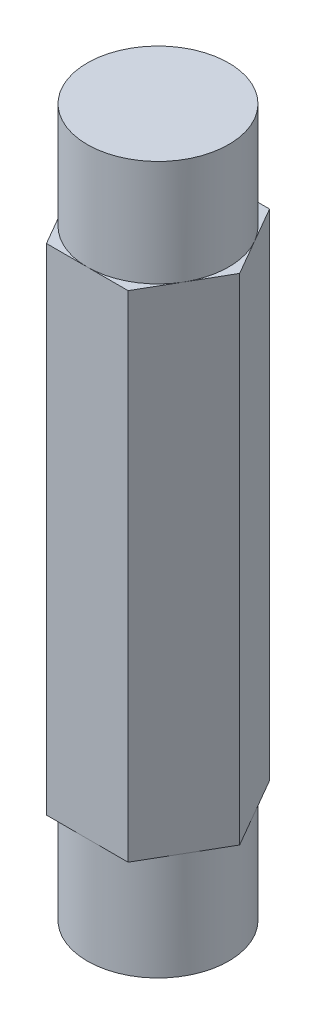
ISO-10303-21;
HEADER;
FILE_DESCRIPTION(('STEP AP214'),'2;1');
FILE_NAME('part.step','',(''),(''),'','','');
FILE_SCHEMA(('AUTOMOTIVE_DESIGN { 1 0 10303 214 1 1 1 1 }'));
ENDSEC;
DATA;
#1=APPLICATION_CONTEXT('core data for automotive mechanical design processes');
#2=APPLICATION_PROTOCOL_DEFINITION('international standard','automotive_design',2000,#1);
#3=PRODUCT_CONTEXT('',#1,'mechanical');
#4=PRODUCT('Part','Part','',(#3));
#5=PRODUCT_RELATED_PRODUCT_CATEGORY('part','',(#4));
#6=PRODUCT_DEFINITION_FORMATION('','',#4);
#7=PRODUCT_DEFINITION_CONTEXT('part definition',#1,'design');
#8=PRODUCT_DEFINITION('design','',#6,#7);
#9=PRODUCT_DEFINITION_SHAPE('','',#8);
#10=(LENGTH_UNIT() NAMED_UNIT(*) SI_UNIT(.MILLI.,.METRE.));
#11=(NAMED_UNIT(*) PLANE_ANGLE_UNIT() SI_UNIT($,.RADIAN.));
#12=(NAMED_UNIT(*) SI_UNIT($,.STERADIAN.) SOLID_ANGLE_UNIT());
#13=UNCERTAINTY_MEASURE_WITH_UNIT(LENGTH_MEASURE(1.E-05),#10,'distance_accuracy_value','');
#14=(GEOMETRIC_REPRESENTATION_CONTEXT(3) GLOBAL_UNCERTAINTY_ASSIGNED_CONTEXT((#13)) GLOBAL_UNIT_ASSIGNED_CONTEXT((#10,
#11,#12)) REPRESENTATION_CONTEXT('',''));
#15=CARTESIAN_POINT('',(0.,0.,0.));
#16=DIRECTION('',(0.,0.,1.));
#17=DIRECTION('',(1.,0.,0.));
#18=AXIS2_PLACEMENT_3D('',#15,#16,#17);
#19=CARTESIAN_POINT('',(0.,-7.,0.));
#20=DIRECTION('',(0.,1.,0.));
#21=DIRECTION('',(0.,0.,1.));
#22=AXIS2_PLACEMENT_3D('',#19,#20,#21);
#23=PLANE('',#22);
#24=DIRECTION('',(1.,0.,0.));
#25=VECTOR('',#24,1.);
#26=CARTESIAN_POINT('',(-1.15470053837925,-7.,2.));
#27=LINE('',#26,#25);
#28=CARTESIAN_POINT('',(0.,-7.,2.));
#29=VERTEX_POINT('',#28);
#30=CARTESIAN_POINT('',(1.15470053837925,-7.,2.));
#31=VERTEX_POINT('',#30);
#32=EDGE_CURVE('E138',#29,#31,#27,.T.);
#33=ORIENTED_EDGE('',*,*,#32,.F.);
#34=CARTESIAN_POINT('',(0.,-7.,0.));
#35=DIRECTION('',(0.,1.,0.));
#36=DIRECTION('',(0.,0.,1.));
#37=AXIS2_PLACEMENT_3D('',#34,#35,#36);
#38=CIRCLE('',#37,2.);
#39=CARTESIAN_POINT('',(1.73205080756887,-7.,0.999999999999999));
#40=VERTEX_POINT('',#39);
#41=EDGE_CURVE('E49',#29,#40,#38,.T.);
#42=ORIENTED_EDGE('',*,*,#41,.T.);
#43=DIRECTION('',(0.5,0.,-0.866025403784439));
#44=VECTOR('',#43,1.);
#45=CARTESIAN_POINT('',(1.15470053837925,-7.,2.));
#46=LINE('',#45,#44);
#47=EDGE_CURVE('E140',#31,#40,#46,.T.);
#48=ORIENTED_EDGE('',*,*,#47,.F.);
#49=EDGE_LOOP('',(#33,#42,#48));
#50=FACE_BOUND('',#49,.T.);
#51=ADVANCED_FACE('F39',(#50),#23,.F.);
#52=CARTESIAN_POINT('',(2.3094010767585,-7.,0.));
#53=VERTEX_POINT('',#52);
#54=EDGE_CURVE('E141',#40,#53,#46,.T.);
#55=ORIENTED_EDGE('',*,*,#54,.F.);
#56=CARTESIAN_POINT('',(1.73205080756888,-7.,-0.999999999999998));
#57=VERTEX_POINT('',#56);
#58=EDGE_CURVE('E11',#40,#57,#38,.T.);
#59=ORIENTED_EDGE('',*,*,#58,.T.);
#60=DIRECTION('',(-0.5,0.,-0.866025403784439));
#61=VECTOR('',#60,1.);
#62=CARTESIAN_POINT('',(2.3094010767585,-7.,0.));
#63=LINE('',#62,#61);
#64=EDGE_CURVE('E148',#53,#57,#63,.T.);
#65=ORIENTED_EDGE('',*,*,#64,.F.);
#66=EDGE_LOOP('',(#55,#59,#65));
#67=FACE_BOUND('',#66,.T.);
#68=ADVANCED_FACE('F145',(#67),#23,.F.);
#69=CARTESIAN_POINT('',(1.15470053837925,-7.,-2.));
#70=VERTEX_POINT('',#69);
#71=EDGE_CURVE('E160',#57,#70,#63,.T.);
#72=ORIENTED_EDGE('',*,*,#71,.F.);
#73=CARTESIAN_POINT('',(0.,-7.,-2.));
#74=VERTEX_POINT('',#73);
#75=EDGE_CURVE('E48',#57,#74,#38,.T.);
#76=ORIENTED_EDGE('',*,*,#75,.T.);
#77=DIRECTION('',(-1.,0.,0.));
#78=VECTOR('',#77,1.);
#79=CARTESIAN_POINT('',(1.15470053837925,-7.,-2.));
#80=LINE('',#79,#78);
#81=EDGE_CURVE('E233',#70,#74,#80,.T.);
#82=ORIENTED_EDGE('',*,*,#81,.F.);
#83=EDGE_LOOP('',(#72,#76,#82));
#84=FACE_BOUND('',#83,.T.);
#85=ADVANCED_FACE('F265',(#84),#23,.F.);
#86=CARTESIAN_POINT('',(-1.15470053837925,-7.,-2.));
#87=VERTEX_POINT('',#86);
#88=EDGE_CURVE('E199',#74,#87,#80,.T.);
#89=ORIENTED_EDGE('',*,*,#88,.F.);
#90=CARTESIAN_POINT('',(-1.73205080756887,-7.,-0.999999999999999));
#91=VERTEX_POINT('',#90);
#92=EDGE_CURVE('E258',#74,#91,#38,.T.);
#93=ORIENTED_EDGE('',*,*,#92,.T.);
#94=DIRECTION('',(-0.5,0.,0.866025403784439));
#95=VECTOR('',#94,1.);
#96=CARTESIAN_POINT('',(-1.15470053837925,-7.,-2.));
#97=LINE('',#96,#95);
#98=EDGE_CURVE('E240',#87,#91,#97,.T.);
#99=ORIENTED_EDGE('',*,*,#98,.F.);
#100=EDGE_LOOP('',(#89,#93,#99));
#101=FACE_BOUND('',#100,.T.);
#102=ADVANCED_FACE('F263',(#101),#23,.F.);
#103=CARTESIAN_POINT('',(-2.3094010767585,-7.,0.));
#104=VERTEX_POINT('',#103);
#105=EDGE_CURVE('E237',#91,#104,#97,.T.);
#106=ORIENTED_EDGE('',*,*,#105,.F.);
#107=CARTESIAN_POINT('',(-1.73205080756888,-7.,0.999999999999998));
#108=VERTEX_POINT('',#107);
#109=EDGE_CURVE('E201',#91,#108,#38,.T.);
#110=ORIENTED_EDGE('',*,*,#109,.T.);
#111=DIRECTION('',(0.5,0.,0.866025403784439));
#112=VECTOR('',#111,1.);
#113=CARTESIAN_POINT('',(-2.3094010767585,-7.,0.));
#114=LINE('',#113,#112);
#115=EDGE_CURVE('E239',#104,#108,#114,.T.);
#116=ORIENTED_EDGE('',*,*,#115,.F.);
#117=EDGE_LOOP('',(#106,#110,#116));
#118=FACE_BOUND('',#117,.T.);
#119=ADVANCED_FACE('F254',(#118),#23,.F.);
#120=CARTESIAN_POINT('',(0.,7.,0.));
#121=DIRECTION('',(0.,1.,0.));
#122=DIRECTION('',(0.,0.,1.));
#123=AXIS2_PLACEMENT_3D('',#120,#121,#122);
#124=PLANE('',#123);
#125=CARTESIAN_POINT('',(0.,7.,0.));
#126=DIRECTION('',(0.,1.,0.));
#127=DIRECTION('',(0.,0.,1.));
#128=AXIS2_PLACEMENT_3D('',#125,#126,#127);
#129=CIRCLE('',#128,2.);
#130=CARTESIAN_POINT('',(0.,7.,2.));
#131=VERTEX_POINT('',#130);
#132=CARTESIAN_POINT('',(1.73205080756887,7.,0.999999999999999));
#133=VERTEX_POINT('',#132);
#134=EDGE_CURVE('E189',#131,#133,#129,.T.);
#135=ORIENTED_EDGE('',*,*,#134,.F.);
#136=DIRECTION('',(1.,0.,0.));
#137=VECTOR('',#136,1.);
#138=CARTESIAN_POINT('',(-1.15470053837925,7.,2.));
#139=LINE('',#138,#137);
#140=CARTESIAN_POINT('',(1.15470053837925,7.,2.));
#141=VERTEX_POINT('',#140);
#142=EDGE_CURVE('E223',#131,#141,#139,.T.);
#143=ORIENTED_EDGE('',*,*,#142,.T.);
#144=DIRECTION('',(0.5,0.,-0.866025403784439));
#145=VECTOR('',#144,1.);
#146=CARTESIAN_POINT('',(1.15470053837925,7.,2.));
#147=LINE('',#146,#145);
#148=EDGE_CURVE('E226',#141,#133,#147,.T.);
#149=ORIENTED_EDGE('',*,*,#148,.T.);
#150=EDGE_LOOP('',(#135,#143,#149));
#151=FACE_BOUND('',#150,.T.);
#152=ADVANCED_FACE('F269',(#151),#124,.T.);
#153=CARTESIAN_POINT('',(1.73205080756888,7.,-0.999999999999999));
#154=VERTEX_POINT('',#153);
#155=EDGE_CURVE('E198',#133,#154,#129,.T.);
#156=ORIENTED_EDGE('',*,*,#155,.F.);
#157=CARTESIAN_POINT('',(2.3094010767585,7.,0.));
#158=VERTEX_POINT('',#157);
#159=EDGE_CURVE('E229',#133,#158,#147,.T.);
#160=ORIENTED_EDGE('',*,*,#159,.T.);
#161=DIRECTION('',(-0.5,0.,-0.866025403784439));
#162=VECTOR('',#161,1.);
#163=CARTESIAN_POINT('',(2.3094010767585,7.,0.));
#164=LINE('',#163,#162);
#165=EDGE_CURVE('E170',#158,#154,#164,.T.);
#166=ORIENTED_EDGE('',*,*,#165,.T.);
#167=EDGE_LOOP('',(#156,#160,#166));
#168=FACE_BOUND('',#167,.T.);
#169=ADVANCED_FACE('F275',(#168),#124,.T.);
#170=CARTESIAN_POINT('',(0.,7.,-2.));
#171=VERTEX_POINT('',#170);
#172=EDGE_CURVE('E61',#154,#171,#129,.T.);
#173=ORIENTED_EDGE('',*,*,#172,.F.);
#174=CARTESIAN_POINT('',(1.15470053837925,7.,-2.));
#175=VERTEX_POINT('',#174);
#176=EDGE_CURVE('E216',#154,#175,#164,.T.);
#177=ORIENTED_EDGE('',*,*,#176,.T.);
#178=DIRECTION('',(-1.,0.,0.));
#179=VECTOR('',#178,1.);
#180=CARTESIAN_POINT('',(1.15470053837925,7.,-2.));
#181=LINE('',#180,#179);
#182=EDGE_CURVE('E212',#175,#171,#181,.T.);
#183=ORIENTED_EDGE('',*,*,#182,.T.);
#184=EDGE_LOOP('',(#173,#177,#183));
#185=FACE_BOUND('',#184,.T.);
#186=ADVANCED_FACE('F214',(#185),#124,.T.);
#187=CARTESIAN_POINT('',(-1.73205080756888,7.,-1.));
#188=VERTEX_POINT('',#187);
#189=EDGE_CURVE('E191',#171,#188,#129,.T.);
#190=ORIENTED_EDGE('',*,*,#189,.F.);
#191=CARTESIAN_POINT('',(-1.15470053837925,7.,-2.));
#192=VERTEX_POINT('',#191);
#193=EDGE_CURVE('E165',#171,#192,#181,.T.);
#194=ORIENTED_EDGE('',*,*,#193,.T.);
#195=DIRECTION('',(-0.5,0.,0.866025403784439));
#196=VECTOR('',#195,1.);
#197=CARTESIAN_POINT('',(-1.15470053837925,7.,-2.));
#198=LINE('',#197,#196);
#199=EDGE_CURVE('E209',#192,#188,#198,.T.);
#200=ORIENTED_EDGE('',*,*,#199,.T.);
#201=EDGE_LOOP('',(#190,#194,#200));
#202=FACE_BOUND('',#201,.T.);
#203=ADVANCED_FACE('F207',(#202),#124,.T.);
#204=CARTESIAN_POINT('',(-1.73205080756888,7.,0.999999999999998));
#205=VERTEX_POINT('',#204);
#206=EDGE_CURVE('E187',#188,#205,#129,.T.);
#207=ORIENTED_EDGE('',*,*,#206,.F.);
#208=CARTESIAN_POINT('',(-2.3094010767585,7.,0.));
#209=VERTEX_POINT('',#208);
#210=EDGE_CURVE('E217',#188,#209,#198,.T.);
#211=ORIENTED_EDGE('',*,*,#210,.T.);
#212=DIRECTION('',(0.5,0.,0.866025403784439));
#213=VECTOR('',#212,1.);
#214=CARTESIAN_POINT('',(-2.3094010767585,7.,0.));
#215=LINE('',#214,#213);
#216=EDGE_CURVE('E225',#209,#205,#215,.T.);
#217=ORIENTED_EDGE('',*,*,#216,.T.);
#218=EDGE_LOOP('',(#207,#211,#217));
#219=FACE_BOUND('',#218,.T.);
#220=ADVANCED_FACE('F284',(#219),#124,.T.);
#221=CARTESIAN_POINT('',(1.15470053837925,7.,-2.));
#222=DIRECTION('',(0.,0.,1.));
#223=DIRECTION('',(1.,0.,0.));
#224=AXIS2_PLACEMENT_3D('',#221,#222,#223);
#225=PLANE('',#224);
#226=ORIENTED_EDGE('',*,*,#81,.T.);
#227=ORIENTED_EDGE('',*,*,#88,.T.);
#228=DIRECTION('',(0.,-1.,0.));
#229=VECTOR('',#228,1.);
#230=CARTESIAN_POINT('',(-1.15470053837925,7.,-2.));
#231=LINE('',#230,#229);
#232=EDGE_CURVE('E43',#192,#87,#231,.T.);
#233=ORIENTED_EDGE('',*,*,#232,.F.);
#234=ORIENTED_EDGE('',*,*,#193,.F.);
#235=ORIENTED_EDGE('',*,*,#182,.F.);
#236=DIRECTION('',(0.,-1.,0.));
#237=VECTOR('',#236,1.);
#238=CARTESIAN_POINT('',(1.15470053837925,7.,-2.));
#239=LINE('',#238,#237);
#240=EDGE_CURVE('E162',#175,#70,#239,.T.);
#241=ORIENTED_EDGE('',*,*,#240,.T.);
#242=EDGE_LOOP('',(#226,#227,#233,#234,#235,#241));
#243=FACE_BOUND('',#242,.T.);
#244=ADVANCED_FACE('F41',(#243),#225,.F.);
#245=CARTESIAN_POINT('',(-1.15470053837925,7.,-2.));
#246=DIRECTION('',(0.866025403784438,0.,0.5));
#247=DIRECTION('',(0.5,0.,-0.866025403784439));
#248=AXIS2_PLACEMENT_3D('',#245,#246,#247);
#249=PLANE('',#248);
#250=ORIENTED_EDGE('',*,*,#98,.T.);
#251=ORIENTED_EDGE('',*,*,#105,.T.);
#252=DIRECTION('',(0.,-1.,0.));
#253=VECTOR('',#252,1.);
#254=CARTESIAN_POINT('',(-2.3094010767585,7.,0.));
#255=LINE('',#254,#253);
#256=EDGE_CURVE('E175',#209,#104,#255,.T.);
#257=ORIENTED_EDGE('',*,*,#256,.F.);
#258=ORIENTED_EDGE('',*,*,#210,.F.);
#259=ORIENTED_EDGE('',*,*,#199,.F.);
#260=ORIENTED_EDGE('',*,*,#232,.T.);
#261=EDGE_LOOP('',(#250,#251,#257,#258,#259,#260));
#262=FACE_BOUND('',#261,.T.);
#263=ADVANCED_FACE('F430',(#262),#249,.F.);
#264=CARTESIAN_POINT('',(-2.3094010767585,7.,0.));
#265=DIRECTION('',(0.866025403784439,0.,-0.5));
#266=DIRECTION('',(-0.5,0.,-0.866025403784439));
#267=AXIS2_PLACEMENT_3D('',#264,#265,#266);
#268=PLANE('',#267);
#269=ORIENTED_EDGE('',*,*,#115,.T.);
#270=CARTESIAN_POINT('',(-1.15470053837925,-7.,2.));
#271=VERTEX_POINT('',#270);
#272=EDGE_CURVE('E236',#108,#271,#114,.T.);
#273=ORIENTED_EDGE('',*,*,#272,.T.);
#274=DIRECTION('',(0.,-1.,0.));
#275=VECTOR('',#274,1.);
#276=CARTESIAN_POINT('',(-1.15470053837925,7.,2.));
#277=LINE('',#276,#275);
#278=CARTESIAN_POINT('',(-1.15470053837925,7.,2.));
#279=VERTEX_POINT('',#278);
#280=EDGE_CURVE('E168',#279,#271,#277,.T.);
#281=ORIENTED_EDGE('',*,*,#280,.F.);
#282=EDGE_CURVE('E222',#205,#279,#215,.T.);
#283=ORIENTED_EDGE('',*,*,#282,.F.);
#284=ORIENTED_EDGE('',*,*,#216,.F.);
#285=ORIENTED_EDGE('',*,*,#256,.T.);
#286=EDGE_LOOP('',(#269,#273,#281,#283,#284,#285));
#287=FACE_BOUND('',#286,.T.);
#288=ADVANCED_FACE('F245',(#287),#268,.F.);
#289=CARTESIAN_POINT('',(-1.15470053837925,7.,2.));
#290=DIRECTION('',(0.,0.,-1.));
#291=DIRECTION('',(-1.,0.,0.));
#292=AXIS2_PLACEMENT_3D('',#289,#290,#291);
#293=PLANE('',#292);
#294=EDGE_CURVE('E147',#271,#29,#27,.T.);
#295=ORIENTED_EDGE('',*,*,#294,.T.);
#296=ORIENTED_EDGE('',*,*,#32,.T.);
#297=DIRECTION('',(0.,-1.,0.));
#298=VECTOR('',#297,1.);
#299=CARTESIAN_POINT('',(1.15470053837925,7.,2.));
#300=LINE('',#299,#298);
#301=EDGE_CURVE('E156',#141,#31,#300,.T.);
#302=ORIENTED_EDGE('',*,*,#301,.F.);
#303=ORIENTED_EDGE('',*,*,#142,.F.);
#304=EDGE_CURVE('E227',#279,#131,#139,.T.);
#305=ORIENTED_EDGE('',*,*,#304,.F.);
#306=ORIENTED_EDGE('',*,*,#280,.T.);
#307=EDGE_LOOP('',(#295,#296,#302,#303,#305,#306));
#308=FACE_BOUND('',#307,.T.);
#309=ADVANCED_FACE('F250',(#308),#293,.F.);
#310=CARTESIAN_POINT('',(1.15470053837925,7.,2.));
#311=DIRECTION('',(-0.866025403784438,0.,-0.5));
#312=DIRECTION('',(-0.5,0.,0.866025403784439));
#313=AXIS2_PLACEMENT_3D('',#310,#311,#312);
#314=PLANE('',#313);
#315=ORIENTED_EDGE('',*,*,#47,.T.);
#316=ORIENTED_EDGE('',*,*,#54,.T.);
#317=DIRECTION('',(0.,-1.,0.));
#318=VECTOR('',#317,1.);
#319=CARTESIAN_POINT('',(2.3094010767585,7.,0.));
#320=LINE('',#319,#318);
#321=EDGE_CURVE('E167',#158,#53,#320,.T.);
#322=ORIENTED_EDGE('',*,*,#321,.F.);
#323=ORIENTED_EDGE('',*,*,#159,.F.);
#324=ORIENTED_EDGE('',*,*,#148,.F.);
#325=ORIENTED_EDGE('',*,*,#301,.T.);
#326=EDGE_LOOP('',(#315,#316,#322,#323,#324,#325));
#327=FACE_BOUND('',#326,.T.);
#328=ADVANCED_FACE('F153',(#327),#314,.F.);
#329=CARTESIAN_POINT('',(2.3094010767585,7.,0.));
#330=DIRECTION('',(-0.866025403784439,0.,0.5));
#331=DIRECTION('',(0.5,0.,0.866025403784439));
#332=AXIS2_PLACEMENT_3D('',#329,#330,#331);
#333=PLANE('',#332);
#334=ORIENTED_EDGE('',*,*,#64,.T.);
#335=ORIENTED_EDGE('',*,*,#71,.T.);
#336=ORIENTED_EDGE('',*,*,#240,.F.);
#337=ORIENTED_EDGE('',*,*,#176,.F.);
#338=ORIENTED_EDGE('',*,*,#165,.F.);
#339=ORIENTED_EDGE('',*,*,#321,.T.);
#340=EDGE_LOOP('',(#334,#335,#336,#337,#338,#339));
#341=FACE_BOUND('',#340,.T.);
#342=ADVANCED_FACE('F264',(#341),#333,.F.);
#343=EDGE_CURVE('E177',#205,#131,#129,.T.);
#344=ORIENTED_EDGE('',*,*,#343,.F.);
#345=ORIENTED_EDGE('',*,*,#282,.T.);
#346=ORIENTED_EDGE('',*,*,#304,.T.);
#347=EDGE_LOOP('',(#344,#345,#346));
#348=FACE_BOUND('',#347,.T.);
#349=ADVANCED_FACE('F273',(#348),#124,.T.);
#350=ORIENTED_EDGE('',*,*,#272,.F.);
#351=EDGE_CURVE('E142',#108,#29,#38,.T.);
#352=ORIENTED_EDGE('',*,*,#351,.T.);
#353=ORIENTED_EDGE('',*,*,#294,.F.);
#354=EDGE_LOOP('',(#350,#352,#353));
#355=FACE_BOUND('',#354,.T.);
#356=ADVANCED_FACE('F247',(#355),#23,.F.);
#357=CARTESIAN_POINT('',(0.,10.,0.));
#358=DIRECTION('',(0.,-1.,0.));
#359=DIRECTION('',(0.,0.,-1.));
#360=AXIS2_PLACEMENT_3D('',#357,#358,#359);
#361=CYLINDRICAL_SURFACE('',#360,2.);
#362=CARTESIAN_POINT('',(0.,10.,0.));
#363=DIRECTION('',(0.,1.,0.));
#364=DIRECTION('',(0.,0.,1.));
#365=AXIS2_PLACEMENT_3D('',#362,#363,#364);
#366=CIRCLE('',#365,2.);
#367=CARTESIAN_POINT('',(0.,10.,2.));
#368=VERTEX_POINT('',#367);
#369=EDGE_CURVE('E192',#368,#368,#366,.T.);
#370=ORIENTED_EDGE('',*,*,#369,.F.);
#371=EDGE_LOOP('',(#370));
#372=FACE_BOUND('',#371,.T.);
#373=ORIENTED_EDGE('',*,*,#134,.T.);
#374=ORIENTED_EDGE('',*,*,#155,.T.);
#375=ORIENTED_EDGE('',*,*,#172,.T.);
#376=ORIENTED_EDGE('',*,*,#189,.T.);
#377=ORIENTED_EDGE('',*,*,#206,.T.);
#378=ORIENTED_EDGE('',*,*,#343,.T.);
#379=EDGE_LOOP('',(#373,#374,#375,#376,#377,#378));
#380=FACE_BOUND('',#379,.T.);
#381=ADVANCED_FACE('F202',(#372,#380),#361,.T.);
#382=CARTESIAN_POINT('',(0.,10.,0.));
#383=DIRECTION('',(0.,1.,0.));
#384=DIRECTION('',(0.,0.,1.));
#385=AXIS2_PLACEMENT_3D('',#382,#383,#384);
#386=PLANE('',#385);
#387=ORIENTED_EDGE('',*,*,#369,.T.);
#388=EDGE_LOOP('',(#387));
#389=FACE_BOUND('',#388,.T.);
#390=ADVANCED_FACE('F297',(#389),#386,.T.);
#391=CARTESIAN_POINT('',(0.,-10.,0.));
#392=DIRECTION('',(0.,1.,0.));
#393=DIRECTION('',(0.,0.,1.));
#394=AXIS2_PLACEMENT_3D('',#391,#392,#393);
#395=CYLINDRICAL_SURFACE('',#394,2.);
#396=CARTESIAN_POINT('',(0.,-10.,0.));
#397=DIRECTION('',(0.,1.,0.));
#398=DIRECTION('',(0.,0.,1.));
#399=AXIS2_PLACEMENT_3D('',#396,#397,#398);
#400=CIRCLE('',#399,2.);
#401=CARTESIAN_POINT('',(0.,-10.,2.));
#402=VERTEX_POINT('',#401);
#403=EDGE_CURVE('E143',#402,#402,#400,.T.);
#404=ORIENTED_EDGE('',*,*,#403,.T.);
#405=EDGE_LOOP('',(#404));
#406=FACE_BOUND('',#405,.T.);
#407=ORIENTED_EDGE('',*,*,#41,.F.);
#408=ORIENTED_EDGE('',*,*,#351,.F.);
#409=ORIENTED_EDGE('',*,*,#109,.F.);
#410=ORIENTED_EDGE('',*,*,#92,.F.);
#411=ORIENTED_EDGE('',*,*,#75,.F.);
#412=ORIENTED_EDGE('',*,*,#58,.F.);
#413=EDGE_LOOP('',(#407,#408,#409,#410,#411,#412));
#414=FACE_BOUND('',#413,.T.);
#415=ADVANCED_FACE('F126',(#406,#414),#395,.T.);
#416=CARTESIAN_POINT('',(0.,-10.,0.));
#417=DIRECTION('',(0.,-1.,0.));
#418=DIRECTION('',(0.,0.,1.));
#419=AXIS2_PLACEMENT_3D('',#416,#417,#418);
#420=PLANE('',#419);
#421=ORIENTED_EDGE('',*,*,#403,.F.);
#422=EDGE_LOOP('',(#421));
#423=FACE_BOUND('',#422,.T.);
#424=ADVANCED_FACE('F302',(#423),#420,.T.);
#425=CLOSED_SHELL('',(#51,#68,#85,#102,#119,#152,#169,#186,#203,#220,#244,#263,#288,#309,#328,
#342,#349,#356,#381,#390,#415,#424));
#426=MANIFOLD_SOLID_BREP('B2',#425);
#427=ADVANCED_BREP_SHAPE_REPRESENTATION('',(#18,#426),#14);
#428=SHAPE_DEFINITION_REPRESENTATION(#9,#427);
ENDSEC;
END-ISO-10303-21;
